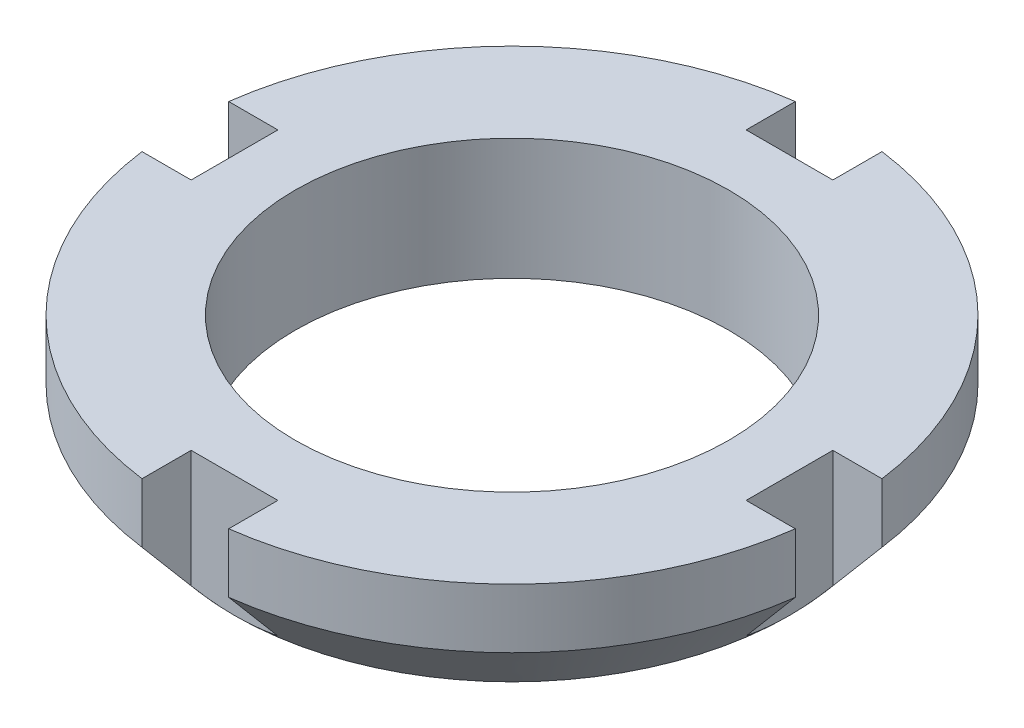
ISO-10303-21;
HEADER;
FILE_DESCRIPTION(('STEP AP214'),'2;1');
FILE_NAME('part.step','',(''),(''),'','','');
FILE_SCHEMA(('AUTOMOTIVE_DESIGN { 1 0 10303 214 1 1 1 1 }'));
ENDSEC;
DATA;
#1=APPLICATION_CONTEXT('core data for automotive mechanical design processes');
#2=APPLICATION_PROTOCOL_DEFINITION('international standard','automotive_design',2000,#1);
#3=PRODUCT_CONTEXT('',#1,'mechanical');
#4=PRODUCT('Part','Part','',(#3));
#5=PRODUCT_RELATED_PRODUCT_CATEGORY('part','',(#4));
#6=PRODUCT_DEFINITION_FORMATION('','',#4);
#7=PRODUCT_DEFINITION_CONTEXT('part definition',#1,'design');
#8=PRODUCT_DEFINITION('design','',#6,#7);
#9=PRODUCT_DEFINITION_SHAPE('','',#8);
#10=(LENGTH_UNIT() NAMED_UNIT(*) SI_UNIT(.MILLI.,.METRE.));
#11=(NAMED_UNIT(*) PLANE_ANGLE_UNIT() SI_UNIT($,.RADIAN.));
#12=(NAMED_UNIT(*) SI_UNIT($,.STERADIAN.) SOLID_ANGLE_UNIT());
#13=UNCERTAINTY_MEASURE_WITH_UNIT(LENGTH_MEASURE(1.E-05),#10,'distance_accuracy_value','');
#14=(GEOMETRIC_REPRESENTATION_CONTEXT(3) GLOBAL_UNCERTAINTY_ASSIGNED_CONTEXT((#13)) GLOBAL_UNIT_ASSIGNED_CONTEXT((#10,
#11,#12)) REPRESENTATION_CONTEXT('',''));
#15=CARTESIAN_POINT('',(0.,0.,0.));
#16=DIRECTION('',(0.,0.,1.));
#17=DIRECTION('',(1.,0.,0.));
#18=AXIS2_PLACEMENT_3D('',#15,#16,#17);
#19=CARTESIAN_POINT('',(0.,25.4,0.));
#20=DIRECTION('',(0.,1.,0.));
#21=DIRECTION('',(0.,0.,1.));
#22=AXIS2_PLACEMENT_3D('',#19,#20,#21);
#23=CYLINDRICAL_SURFACE('',#22,19.);
#24=CARTESIAN_POINT('',(0.,3.57526077778265,0.));
#25=DIRECTION('',(0.,1.,0.));
#26=DIRECTION('',(0.,0.,1.));
#27=AXIS2_PLACEMENT_3D('',#24,#25,#26);
#28=CIRCLE('',#27,19.);
#29=CARTESIAN_POINT('',(2.50000000000013,3.57526077778265,18.8348082018374));
#30=VERTEX_POINT('',#29);
#31=CARTESIAN_POINT('',(18.8348082018374,3.57526077778265,2.4999999999998));
#32=VERTEX_POINT('',#31);
#33=EDGE_CURVE('E182',#30,#32,#28,.T.);
#34=ORIENTED_EDGE('',*,*,#33,.T.);
#35=DIRECTION('',(0.,1.,0.));
#36=VECTOR('',#35,1.);
#37=CARTESIAN_POINT('',(18.8348082018374,0.,2.4999999999998));
#38=LINE('',#37,#36);
#39=CARTESIAN_POINT('',(18.8348082018374,7.,2.4999999999998));
#40=VERTEX_POINT('',#39);
#41=EDGE_CURVE('E167',#32,#40,#38,.T.);
#42=ORIENTED_EDGE('',*,*,#41,.T.);
#43=CARTESIAN_POINT('',(0.,7.,0.));
#44=DIRECTION('',(0.,1.,0.));
#45=DIRECTION('',(0.,0.,1.));
#46=AXIS2_PLACEMENT_3D('',#43,#44,#45);
#47=CIRCLE('',#46,19.);
#48=CARTESIAN_POINT('',(2.50000000000013,7.,18.8348082018374));
#49=VERTEX_POINT('',#48);
#50=EDGE_CURVE('E180',#49,#40,#47,.T.);
#51=ORIENTED_EDGE('',*,*,#50,.F.);
#52=DIRECTION('',(0.,1.,0.));
#53=VECTOR('',#52,1.);
#54=CARTESIAN_POINT('',(2.50000000000013,0.,18.8348082018374));
#55=LINE('',#54,#53);
#56=EDGE_CURVE('E435',#30,#49,#55,.T.);
#57=ORIENTED_EDGE('',*,*,#56,.F.);
#58=EDGE_LOOP('',(#34,#42,#51,#57));
#59=FACE_BOUND('',#58,.T.);
#60=ADVANCED_FACE('F34',(#59),#23,.T.);
#61=CARTESIAN_POINT('',(0.,0.,0.));
#62=DIRECTION('',(0.,1.,0.));
#63=DIRECTION('',(0.,0.,1.));
#64=AXIS2_PLACEMENT_3D('',#61,#62,#63);
#65=CONICAL_SURFACE('',#64,16.,0.698131700797729);
#66=CARTESIAN_POINT('',(15.9999999999999,1.61489603645068,-6.72295034859673));
#67=CARTESIAN_POINT('',(15.9999999999999,1.44047373509679,-6.34510869434057));
#68=CARTESIAN_POINT('',(15.9999999999999,1.27622662881702,-5.96228834394678));
#69=CARTESIAN_POINT('',(15.9999999999999,0.971984978819107,-5.18639270734956));
#70=CARTESIAN_POINT('',(15.9999999999999,0.832033632966314,-4.79330055663925));
#71=CARTESIAN_POINT('',(16.,0.581832993364578,-4.00075954074242));
#72=CARTESIAN_POINT('',(16.,0.471377135707684,-3.60137680626384));
#73=CARTESIAN_POINT('',(16.,0.283057566634732,-2.79516003789773));
#74=CARTESIAN_POINT('',(16.,0.205175049235498,-2.38833044541577));
#75=CARTESIAN_POINT('',(16.,0.084852403778267,-1.56570536854987));
#76=CARTESIAN_POINT('',(16.,0.042732059256799,-1.14986239904967));
#77=CARTESIAN_POINT('',(16.,-0.00274192414034929,-0.315979088964332));
#78=CARTESIAN_POINT('',(16.,-0.00609052371717588,0.102061530192854));
#79=CARTESIAN_POINT('',(16.,0.0262229924393839,0.937865584509501));
#80=CARTESIAN_POINT('',(16.,0.0620015940723355,1.35562446679382));
#81=CARTESIAN_POINT('',(16.,0.170871403131917,2.18612875911361));
#82=CARTESIAN_POINT('',(16.,0.243959665039616,2.59887456228794));
#83=CARTESIAN_POINT('',(16.,0.448304491130726,3.52691600287173));
#84=CARTESIAN_POINT('',(16.,0.589920916839801,4.03992242186738));
#85=CARTESIAN_POINT('',(16.0000000000001,0.919289860365098,5.05138775273406));
#86=CARTESIAN_POINT('',(16.0000000000001,1.10710332069625,5.54982646736915));
#87=CARTESIAN_POINT('',(16.0000000000001,1.41662702056414,6.28518883377966));
#88=CARTESIAN_POINT('',(16.0000000000001,1.52437168721538,6.52813607204458));
#89=CARTESIAN_POINT('',(16.0000000000001,1.74821220876534,7.01018655844719));
#90=CARTESIAN_POINT('',(16.0000000000001,1.86430868421804,7.24928951933009));
#91=CARTESIAN_POINT('',(16.0000000000001,2.10352112249927,7.72291220876518));
#92=CARTESIAN_POINT('',(16.0000000000001,2.22661169322447,7.9574448257165));
#93=CARTESIAN_POINT('',(16.0000000000001,2.47935755411826,8.42286567685714));
#94=CARTESIAN_POINT('',(16.0000000000001,2.60901101550432,8.65375490302752));
#95=CARTESIAN_POINT('',(16.0000000000001,2.74157327875824,8.88293783921777));
#96=B_SPLINE_CURVE_WITH_KNOTS('',3,(#66,#67,#68,#69,#70,#71,#72,#73,#74,#75,#76,#77,#78,#79,#80,
#81,#82,#83,#84,#85,#86,#87,#88,#89,#90,#91,#92,#93,#94,#95),.UNSPECIFIED.,.F.,.F.,(4,2,2,2,2,2,
2,2,2,2,2,2,2,2,4),(0.,1.24870523484581,2.49960842139877,3.74150672198465,4.98268702845874,
6.23485240214252,7.4871805222985,8.74324713315405,9.99921459553451,11.5931258240666,
13.1891511033666,13.9863275505997,14.7835632907354,15.5780696742465,16.3723558704137),.UNSPECIFIED.);
#97=CARTESIAN_POINT('',(16.,0.,-1.6759120133325E-13));
#98=VERTEX_POINT('',#97);
#99=CARTESIAN_POINT('',(16.,0.231360774678533,2.49999999999983));
#100=VERTEX_POINT('',#99);
#101=EDGE_CURVE('E48',#98,#100,#96,.T.);
#102=ORIENTED_EDGE('',*,*,#101,.T.);
#103=CARTESIAN_POINT('',(10.8234084053594,-5.82960231387655,2.49999999999988));
#104=CARTESIAN_POINT('',(11.2906948484899,-5.28692863711743,2.49999999999988));
#105=CARTESIAN_POINT('',(11.7571720455522,-4.74355986676855,2.49999999999987));
#106=CARTESIAN_POINT('',(12.6888761049545,-3.65575309559751,2.49999999999986));
#107=CARTESIAN_POINT('',(13.1541029698447,-3.1113150969601,2.49999999999986));
#108=CARTESIAN_POINT('',(14.0836742113699,-2.02169120495561,2.49999999999985));
#109=CARTESIAN_POINT('',(14.548018592201,-1.47650531516598,2.49999999999985));
#110=CARTESIAN_POINT('',(15.4760358948828,-0.385561874075875,2.49999999999984));
#111=CARTESIAN_POINT('',(15.9397088163375,0.160195677561378,2.49999999999983));
#112=CARTESIAN_POINT('',(17.329960321026,1.79811073321239,2.49999999999982));
#113=CARTESIAN_POINT('',(18.2557759858606,2.89091573333739,2.49999999999981));
#114=CARTESIAN_POINT('',(19.6435462290736,4.53093383921903,2.49999999999979));
#115=CARTESIAN_POINT('',(20.1059785550828,5.07774296956043,2.49999999999979));
#116=CARTESIAN_POINT('',(21.030577170086,6.17158581118825,2.49999999999978));
#117=CARTESIAN_POINT('',(21.4927434591653,6.71861952240252,2.49999999999977));
#118=CARTESIAN_POINT('',(21.954803110937,7.26574332983384,2.49999999999977));
#119=B_SPLINE_CURVE_WITH_KNOTS('',3,(#103,#104,#105,#106,#107,#108,#109,#110,#111,#112,#113,
#114,#115,#116,#117,#118),.UNSPECIFIED.,.F.,.F.,(4,2,2,2,2,2,2,4),(0.,2.14840652143852,
4.29680865762456,6.44520055278312,8.59359371433903,12.89035995552,15.0387534992744,
17.1871463534934),.UNSPECIFIED.);
#120=EDGE_CURVE('E11',#100,#32,#119,.T.);
#121=ORIENTED_EDGE('',*,*,#120,.T.);
#122=ORIENTED_EDGE('',*,*,#33,.F.);
#123=CARTESIAN_POINT('',(2.50000000000016,7.26574332983384,21.9548031109369));
#124=CARTESIAN_POINT('',(2.50000000000015,6.71861952240252,21.4927434591653));
#125=CARTESIAN_POINT('',(2.50000000000015,6.17158581118825,21.0305771700859));
#126=CARTESIAN_POINT('',(2.50000000000014,5.07774296956043,20.1059785550827));
#127=CARTESIAN_POINT('',(2.50000000000014,4.53093383921903,19.6435462290736));
#128=CARTESIAN_POINT('',(2.50000000000013,2.89091573333739,18.2557759858606));
#129=CARTESIAN_POINT('',(2.50000000000012,1.79811073321239,17.329960321026));
#130=CARTESIAN_POINT('',(2.50000000000011,0.160195677561379,15.9397088163375));
#131=CARTESIAN_POINT('',(2.50000000000011,-0.385561874075876,15.4760358948827));
#132=CARTESIAN_POINT('',(2.5000000000001,-1.47650531516598,14.5480185922009));
#133=CARTESIAN_POINT('',(2.5000000000001,-2.02169120495561,14.0836742113698));
#134=CARTESIAN_POINT('',(2.50000000000009,-3.1113150969601,13.1541029698446));
#135=CARTESIAN_POINT('',(2.50000000000009,-3.65575309559751,12.6888761049545));
#136=CARTESIAN_POINT('',(2.50000000000008,-4.74355986676855,11.7571720455522));
#137=CARTESIAN_POINT('',(2.50000000000008,-5.28692863711744,11.2906948484898));
#138=CARTESIAN_POINT('',(2.50000000000008,-5.82960231387655,10.8234084053594));
#139=B_SPLINE_CURVE_WITH_KNOTS('',3,(#123,#124,#125,#126,#127,#128,#129,#130,#131,#132,#133,
#134,#135,#136,#137,#138),.UNSPECIFIED.,.F.,.F.,(4,2,2,2,2,2,2,4),(0.,2.14839285421895,
4.29678639797339,8.59355263915434,10.7419458007103,12.8903376958688,15.0387398320549,
17.1871463534934),.UNSPECIFIED.);
#140=CARTESIAN_POINT('',(2.50000000000011,0.231360774678531,16.));
#141=VERTEX_POINT('',#140);
#142=EDGE_CURVE('E278',#30,#141,#139,.T.);
#143=ORIENTED_EDGE('',*,*,#142,.T.);
#144=CARTESIAN_POINT('',(-6.72295034859645,1.61489603645068,16.));
#145=CARTESIAN_POINT('',(-6.34510869434028,1.44047373509679,16.));
#146=CARTESIAN_POINT('',(-5.9622883439465,1.27622662881702,16.));
#147=CARTESIAN_POINT('',(-5.18639270734928,0.97198497881911,16.));
#148=CARTESIAN_POINT('',(-4.79330055663897,0.832033632966318,16.));
#149=CARTESIAN_POINT('',(-4.00075954074214,0.581832993364579,16.));
#150=CARTESIAN_POINT('',(-3.60137680626355,0.471377135707682,16.));
#151=CARTESIAN_POINT('',(-2.79516003789745,0.283057566634732,16.));
#152=CARTESIAN_POINT('',(-2.38833044541548,0.205175049235502,16.));
#153=CARTESIAN_POINT('',(-1.56570536854959,0.0848524037782735,16.));
#154=CARTESIAN_POINT('',(-1.14986239904938,0.0427320592568017,16.));
#155=CARTESIAN_POINT('',(-0.315979088964047,-0.00274192414035051,16.));
#156=CARTESIAN_POINT('',(0.102061530193139,-0.00609052371717725,16.));
#157=CARTESIAN_POINT('',(0.937865584509786,0.0262229924393843,16.));
#158=CARTESIAN_POINT('',(1.35562446679411,0.0620015940723377,16.));
#159=CARTESIAN_POINT('',(2.1861287591139,0.17087140313192,16.));
#160=CARTESIAN_POINT('',(2.59887456228823,0.243959665039617,16.));
#161=CARTESIAN_POINT('',(3.52691600287202,0.448304491130729,16.));
#162=CARTESIAN_POINT('',(4.03992242186767,0.589920916839806,16.));
#163=CARTESIAN_POINT('',(5.05138775273435,0.919289860365105,16.));
#164=CARTESIAN_POINT('',(5.54982646736944,1.10710332069626,16.));
#165=CARTESIAN_POINT('',(6.28518883377995,1.41662702056414,16.));
#166=CARTESIAN_POINT('',(6.52813607204487,1.52437168721538,16.));
#167=CARTESIAN_POINT('',(7.01018655844748,1.74821220876534,15.9999999999999));
#168=CARTESIAN_POINT('',(7.24928951933037,1.86430868421805,15.9999999999999));
#169=CARTESIAN_POINT('',(7.72291220876547,2.10352112249928,15.9999999999999));
#170=CARTESIAN_POINT('',(7.95744482571679,2.22661169322448,15.9999999999999));
#171=CARTESIAN_POINT('',(8.42286567685743,2.47935755411826,15.9999999999999));
#172=CARTESIAN_POINT('',(8.65375490302781,2.60901101550433,15.9999999999999));
#173=CARTESIAN_POINT('',(8.88293783921806,2.74157327875826,15.9999999999999));
#174=B_SPLINE_CURVE_WITH_KNOTS('',3,(#144,#145,#146,#147,#148,#149,#150,#151,#152,#153,#154,
#155,#156,#157,#158,#159,#160,#161,#162,#163,#164,#165,#166,#167,#168,#169,#170,#171,#172,#173),
.UNSPECIFIED.,.F.,.F.,(4,2,2,2,2,2,2,2,2,2,2,2,2,2,4),(0.,1.24870523484581,2.49960842139877,
3.74150672198464,4.98268702845874,6.23485240214253,7.4871805222985,8.74324713315405,
9.99921459553451,11.5931258240666,13.1891511033666,13.9863275505997,14.7835632907354,
15.5780696742465,16.3723558704137),.UNSPECIFIED.);
#175=CARTESIAN_POINT('',(1.117274675555E-13,0.,16.));
#176=VERTEX_POINT('',#175);
#177=EDGE_CURVE('E287',#141,#176,#174,.F.);
#178=ORIENTED_EDGE('',*,*,#177,.T.);
#179=CARTESIAN_POINT('',(0.,0.,0.));
#180=DIRECTION('',(0.,1.,0.));
#181=DIRECTION('',(0.,0.,1.));
#182=AXIS2_PLACEMENT_3D('',#179,#180,#181);
#183=CIRCLE('',#182,16.);
#184=EDGE_CURVE('E388',#176,#98,#183,.T.);
#185=ORIENTED_EDGE('',*,*,#184,.T.);
#186=EDGE_LOOP('',(#102,#121,#122,#143,#178,#185));
#187=FACE_BOUND('',#186,.T.);
#188=ADVANCED_FACE('F335',(#187),#65,.T.);
#189=CARTESIAN_POINT('',(-18.8348082018374,3.57526077778265,2.50000000000007));
#190=VERTEX_POINT('',#189);
#191=CARTESIAN_POINT('',(-2.49999999999987,3.57526077778265,18.8348082018374));
#192=VERTEX_POINT('',#191);
#193=EDGE_CURVE('E373',#190,#192,#28,.T.);
#194=ORIENTED_EDGE('',*,*,#193,.T.);
#195=DIRECTION('',(0.,1.,0.));
#196=VECTOR('',#195,1.);
#197=CARTESIAN_POINT('',(-2.49999999999987,0.,18.8348082018374));
#198=LINE('',#197,#196);
#199=CARTESIAN_POINT('',(-2.49999999999987,7.,18.8348082018374));
#200=VERTEX_POINT('',#199);
#201=EDGE_CURVE('E432',#192,#200,#198,.T.);
#202=ORIENTED_EDGE('',*,*,#201,.T.);
#203=CARTESIAN_POINT('',(-18.8348082018374,7.,2.50000000000007));
#204=VERTEX_POINT('',#203);
#205=EDGE_CURVE('E190',#204,#200,#47,.T.);
#206=ORIENTED_EDGE('',*,*,#205,.F.);
#207=DIRECTION('',(0.,1.,0.));
#208=VECTOR('',#207,1.);
#209=CARTESIAN_POINT('',(-18.8348082018374,0.,2.50000000000007));
#210=LINE('',#209,#208);
#211=EDGE_CURVE('E418',#190,#204,#210,.T.);
#212=ORIENTED_EDGE('',*,*,#211,.F.);
#213=EDGE_LOOP('',(#194,#202,#206,#212));
#214=FACE_BOUND('',#213,.T.);
#215=ADVANCED_FACE('F336',(#214),#23,.T.);
#216=CARTESIAN_POINT('',(-2.49999999999989,0.231360774678531,16.));
#217=VERTEX_POINT('',#216);
#218=EDGE_CURVE('E310',#176,#217,#174,.F.);
#219=ORIENTED_EDGE('',*,*,#218,.T.);
#220=CARTESIAN_POINT('',(-2.49999999999992,-5.82960231387655,10.8234084053594));
#221=CARTESIAN_POINT('',(-2.49999999999992,-5.28692863711744,11.2906948484899));
#222=CARTESIAN_POINT('',(-2.49999999999992,-4.74355986676855,11.7571720455522));
#223=CARTESIAN_POINT('',(-2.49999999999991,-3.65575309559751,12.6888761049545));
#224=CARTESIAN_POINT('',(-2.49999999999991,-3.1113150969601,13.1541029698447));
#225=CARTESIAN_POINT('',(-2.4999999999999,-2.02169120495562,14.0836742113699));
#226=CARTESIAN_POINT('',(-2.4999999999999,-1.47650531516598,14.548018592201));
#227=CARTESIAN_POINT('',(-2.49999999999989,-0.38556187407588,15.4760358948828));
#228=CARTESIAN_POINT('',(-2.49999999999989,0.160195677561375,15.9397088163375));
#229=CARTESIAN_POINT('',(-2.49999999999988,1.79811073321239,17.329960321026));
#230=CARTESIAN_POINT('',(-2.49999999999987,2.89091573333739,18.2557759858606));
#231=CARTESIAN_POINT('',(-2.49999999999986,4.53093383921902,19.6435462290736));
#232=CARTESIAN_POINT('',(-2.49999999999986,5.07774296956043,20.1059785550828));
#233=CARTESIAN_POINT('',(-2.49999999999985,6.17158581118825,21.030577170086));
#234=CARTESIAN_POINT('',(-2.49999999999985,6.71861952240252,21.4927434591653));
#235=CARTESIAN_POINT('',(-2.49999999999984,7.26574332983384,21.954803110937));
#236=B_SPLINE_CURVE_WITH_KNOTS('',3,(#220,#221,#222,#223,#224,#225,#226,#227,#228,#229,#230,
#231,#232,#233,#234,#235),.UNSPECIFIED.,.F.,.F.,(4,2,2,2,2,2,2,4),(0.,2.14840652143852,
4.29680865762456,6.44520055278312,8.59359371433903,12.89035995552,15.0387534992744,
17.1871463534934),.UNSPECIFIED.);
#237=EDGE_CURVE('E302',#217,#192,#236,.T.);
#238=ORIENTED_EDGE('',*,*,#237,.T.);
#239=ORIENTED_EDGE('',*,*,#193,.F.);
#240=CARTESIAN_POINT('',(-21.9548031109369,7.26574332983384,2.50000000000008));
#241=CARTESIAN_POINT('',(-21.4927434591653,6.71861952240253,2.50000000000008));
#242=CARTESIAN_POINT('',(-21.0305771700859,6.17158581118825,2.50000000000008));
#243=CARTESIAN_POINT('',(-20.1059785550827,5.07774296956043,2.50000000000007));
#244=CARTESIAN_POINT('',(-19.6435462290736,4.53093383921903,2.50000000000007));
#245=CARTESIAN_POINT('',(-18.2557759858606,2.89091573333739,2.50000000000007));
#246=CARTESIAN_POINT('',(-17.329960321026,1.79811073321239,2.50000000000006));
#247=CARTESIAN_POINT('',(-15.9397088163375,0.160195677561376,2.50000000000006));
#248=CARTESIAN_POINT('',(-15.4760358948827,-0.385561874075879,2.50000000000006));
#249=CARTESIAN_POINT('',(-14.5480185922009,-1.47650531516598,2.50000000000005));
#250=CARTESIAN_POINT('',(-14.0836742113698,-2.02169120495562,2.50000000000005));
#251=CARTESIAN_POINT('',(-13.1541029698446,-3.1113150969601,2.50000000000005));
#252=CARTESIAN_POINT('',(-12.6888761049545,-3.65575309559751,2.50000000000005));
#253=CARTESIAN_POINT('',(-11.7571720455522,-4.74355986676855,2.50000000000004));
#254=CARTESIAN_POINT('',(-11.2906948484898,-5.28692863711744,2.50000000000004));
#255=CARTESIAN_POINT('',(-10.8234084053594,-5.82960231387655,2.50000000000004));
#256=B_SPLINE_CURVE_WITH_KNOTS('',3,(#240,#241,#242,#243,#244,#245,#246,#247,#248,#249,#250,
#251,#252,#253,#254,#255),.UNSPECIFIED.,.F.,.F.,(4,2,2,2,2,2,2,4),(0.,2.14839285421895,
4.29678639797339,8.59355263915435,10.7419458007103,12.8903376958688,15.0387398320549,
17.1871463534934),.UNSPECIFIED.);
#257=CARTESIAN_POINT('',(-16.,0.231360774678528,2.50000000000006));
#258=VERTEX_POINT('',#257);
#259=EDGE_CURVE('E244',#190,#258,#256,.T.);
#260=ORIENTED_EDGE('',*,*,#259,.T.);
#261=CARTESIAN_POINT('',(-16.,1.61489603645068,-6.7229503485965));
#262=CARTESIAN_POINT('',(-16.,1.44047373509679,-6.34510869434034));
#263=CARTESIAN_POINT('',(-16.,1.27622662881702,-5.96228834394656));
#264=CARTESIAN_POINT('',(-16.,0.971984978819105,-5.18639270734934));
#265=CARTESIAN_POINT('',(-16.,0.832033632966313,-4.79330055663902));
#266=CARTESIAN_POINT('',(-16.,0.581832993364577,-4.00075954074219));
#267=CARTESIAN_POINT('',(-16.,0.471377135707682,-3.60137680626361));
#268=CARTESIAN_POINT('',(-16.,0.283057566634733,-2.7951600378975));
#269=CARTESIAN_POINT('',(-16.,0.205175049235501,-2.38833044541554));
#270=CARTESIAN_POINT('',(-16.,0.0848524037782706,-1.56570536854964));
#271=CARTESIAN_POINT('',(-16.,0.0427320592567998,-1.14986239904944));
#272=CARTESIAN_POINT('',(-16.,-0.00274192414035069,-0.315979088964102));
#273=CARTESIAN_POINT('',(-16.,-0.00609052371717659,0.102061530193084));
#274=CARTESIAN_POINT('',(-16.,0.0262229924393837,0.93786558450973));
#275=CARTESIAN_POINT('',(-16.,0.062001594072335,1.35562446679405));
#276=CARTESIAN_POINT('',(-16.,0.170871403131917,2.18612875911384));
#277=CARTESIAN_POINT('',(-16.,0.243959665039615,2.59887456228817));
#278=CARTESIAN_POINT('',(-16.,0.448304491130727,3.52691600287196));
#279=CARTESIAN_POINT('',(-16.,0.589920916839803,4.03992242186761));
#280=CARTESIAN_POINT('',(-16.,0.919289860365102,5.05138775273429));
#281=CARTESIAN_POINT('',(-16.,1.10710332069625,5.54982646736938));
#282=CARTESIAN_POINT('',(-16.,1.41662702056414,6.28518883377989));
#283=CARTESIAN_POINT('',(-16.,1.52437168721538,6.52813607204481));
#284=CARTESIAN_POINT('',(-16.,1.74821220876534,7.01018655844742));
#285=CARTESIAN_POINT('',(-16.,1.86430868421805,7.24928951933032));
#286=CARTESIAN_POINT('',(-16.,2.10352112249928,7.72291220876542));
#287=CARTESIAN_POINT('',(-16.,2.22661169322448,7.95744482571674));
#288=CARTESIAN_POINT('',(-16.,2.47935755411826,8.42286567685738));
#289=CARTESIAN_POINT('',(-16.,2.60901101550433,8.65375490302775));
#290=CARTESIAN_POINT('',(-16.,2.74157327875825,8.88293783921801));
#291=B_SPLINE_CURVE_WITH_KNOTS('',3,(#261,#262,#263,#264,#265,#266,#267,#268,#269,#270,#271,
#272,#273,#274,#275,#276,#277,#278,#279,#280,#281,#282,#283,#284,#285,#286,#287,#288,#289,#290),
.UNSPECIFIED.,.F.,.F.,(4,2,2,2,2,2,2,2,2,2,2,2,2,2,4),(0.,1.24870523484581,2.49960842139877,
3.74150672198464,4.98268702845874,6.23485240214253,7.4871805222985,8.74324713315405,
9.99921459553451,11.5931258240666,13.1891511033666,13.9863275505997,14.7835632907354,
15.5780696742465,16.3723558704137),.UNSPECIFIED.);
#292=CARTESIAN_POINT('',(-16.,0.,0.));
#293=VERTEX_POINT('',#292);
#294=EDGE_CURVE('E253',#258,#293,#291,.F.);
#295=ORIENTED_EDGE('',*,*,#294,.T.);
#296=EDGE_CURVE('E382',#293,#176,#183,.T.);
#297=ORIENTED_EDGE('',*,*,#296,.T.);
#298=EDGE_LOOP('',(#219,#238,#239,#260,#295,#297));
#299=FACE_BOUND('',#298,.T.);
#300=ADVANCED_FACE('F342',(#299),#65,.T.);
#301=CARTESIAN_POINT('',(-2.5,3.57526077778265,-18.8348082018374));
#302=VERTEX_POINT('',#301);
#303=CARTESIAN_POINT('',(-18.8348082018374,3.57526077778265,-2.49999999999994));
#304=VERTEX_POINT('',#303);
#305=EDGE_CURVE('E195',#302,#304,#28,.T.);
#306=ORIENTED_EDGE('',*,*,#305,.T.);
#307=DIRECTION('',(0.,1.,0.));
#308=VECTOR('',#307,1.);
#309=CARTESIAN_POINT('',(-18.8348082018374,0.,-2.49999999999994));
#310=LINE('',#309,#308);
#311=CARTESIAN_POINT('',(-18.8348082018374,7.,-2.49999999999994));
#312=VERTEX_POINT('',#311);
#313=EDGE_CURVE('E371',#304,#312,#310,.T.);
#314=ORIENTED_EDGE('',*,*,#313,.T.);
#315=CARTESIAN_POINT('',(-2.5,7.,-18.8348082018374));
#316=VERTEX_POINT('',#315);
#317=EDGE_CURVE('E194',#316,#312,#47,.T.);
#318=ORIENTED_EDGE('',*,*,#317,.F.);
#319=DIRECTION('',(0.,1.,0.));
#320=VECTOR('',#319,1.);
#321=CARTESIAN_POINT('',(-2.5,0.,-18.8348082018374));
#322=LINE('',#321,#320);
#323=EDGE_CURVE('E372',#302,#316,#322,.T.);
#324=ORIENTED_EDGE('',*,*,#323,.F.);
#325=EDGE_LOOP('',(#306,#314,#318,#324));
#326=FACE_BOUND('',#325,.T.);
#327=ADVANCED_FACE('F346',(#326),#23,.T.);
#328=CARTESIAN_POINT('',(-16.,0.231360774678533,-2.49999999999994));
#329=VERTEX_POINT('',#328);
#330=EDGE_CURVE('E279',#293,#329,#291,.F.);
#331=ORIENTED_EDGE('',*,*,#330,.T.);
#332=CARTESIAN_POINT('',(-10.8234084053594,-5.82960231387655,-2.49999999999996));
#333=CARTESIAN_POINT('',(-11.2906948484899,-5.28692863711744,-2.49999999999996));
#334=CARTESIAN_POINT('',(-11.7571720455522,-4.74355986676855,-2.49999999999996));
#335=CARTESIAN_POINT('',(-12.6888761049545,-3.65575309559751,-2.49999999999995));
#336=CARTESIAN_POINT('',(-13.1541029698447,-3.1113150969601,-2.49999999999995));
#337=CARTESIAN_POINT('',(-14.0836742113699,-2.02169120495561,-2.49999999999995));
#338=CARTESIAN_POINT('',(-14.548018592201,-1.47650531516598,-2.49999999999995));
#339=CARTESIAN_POINT('',(-15.4760358948828,-0.385561874075879,-2.49999999999994));
#340=CARTESIAN_POINT('',(-15.9397088163375,0.160195677561375,-2.49999999999994));
#341=CARTESIAN_POINT('',(-17.329960321026,1.79811073321239,-2.49999999999994));
#342=CARTESIAN_POINT('',(-18.2557759858606,2.89091573333739,-2.49999999999993));
#343=CARTESIAN_POINT('',(-19.6435462290736,4.53093383921903,-2.49999999999993));
#344=CARTESIAN_POINT('',(-20.1059785550828,5.07774296956043,-2.49999999999993));
#345=CARTESIAN_POINT('',(-21.030577170086,6.17158581118825,-2.49999999999992));
#346=CARTESIAN_POINT('',(-21.4927434591653,6.71861952240252,-2.49999999999992));
#347=CARTESIAN_POINT('',(-21.954803110937,7.26574332983384,-2.49999999999992));
#348=B_SPLINE_CURVE_WITH_KNOTS('',3,(#332,#333,#334,#335,#336,#337,#338,#339,#340,#341,#342,
#343,#344,#345,#346,#347),.UNSPECIFIED.,.F.,.F.,(4,2,2,2,2,2,2,4),(0.,2.14840652143852,
4.29680865762456,6.44520055278312,8.59359371433903,12.89035995552,15.0387534992744,
17.1871463534934),.UNSPECIFIED.);
#349=EDGE_CURVE('E271',#329,#304,#348,.T.);
#350=ORIENTED_EDGE('',*,*,#349,.T.);
#351=ORIENTED_EDGE('',*,*,#305,.F.);
#352=CARTESIAN_POINT('',(-2.5,7.26574332983385,-21.954803110937));
#353=CARTESIAN_POINT('',(-2.5,6.71861952240253,-21.4927434591653));
#354=CARTESIAN_POINT('',(-2.5,6.17158581118825,-21.030577170086));
#355=CARTESIAN_POINT('',(-2.5,5.07774296956044,-20.1059785550828));
#356=CARTESIAN_POINT('',(-2.5,4.53093383921903,-19.6435462290736));
#357=CARTESIAN_POINT('',(-2.5,2.89091573333739,-18.2557759858606));
#358=CARTESIAN_POINT('',(-2.5,1.7981107332124,-17.329960321026));
#359=CARTESIAN_POINT('',(-2.5,0.160195677561379,-15.9397088163375));
#360=CARTESIAN_POINT('',(-2.5,-0.385561874075875,-15.4760358948827));
#361=CARTESIAN_POINT('',(-2.5,-1.47650531516598,-14.548018592201));
#362=CARTESIAN_POINT('',(-2.5,-2.02169120495561,-14.0836742113698));
#363=CARTESIAN_POINT('',(-2.5,-3.1113150969601,-13.1541029698447));
#364=CARTESIAN_POINT('',(-2.5,-3.65575309559751,-12.6888761049545));
#365=CARTESIAN_POINT('',(-2.5,-4.74355986676855,-11.7571720455522));
#366=CARTESIAN_POINT('',(-2.5,-5.28692863711744,-11.2906948484898));
#367=CARTESIAN_POINT('',(-2.5,-5.82960231387655,-10.8234084053594));
#368=B_SPLINE_CURVE_WITH_KNOTS('',3,(#352,#353,#354,#355,#356,#357,#358,#359,#360,#361,#362,
#363,#364,#365,#366,#367),.UNSPECIFIED.,.F.,.F.,(4,2,2,2,2,2,2,4),(0.,2.14839285421895,
4.2967863979734,8.59355263915435,10.7419458007103,12.8903376958688,15.0387398320549,
17.1871463534934),.UNSPECIFIED.);
#369=CARTESIAN_POINT('',(-2.5,0.231360774678531,-16.));
#370=VERTEX_POINT('',#369);
#371=EDGE_CURVE('E206',#302,#370,#368,.T.);
#372=ORIENTED_EDGE('',*,*,#371,.T.);
#373=CARTESIAN_POINT('',(-6.72295034859656,1.61489603645068,-16.));
#374=CARTESIAN_POINT('',(-6.3451086943404,1.44047373509679,-16.));
#375=CARTESIAN_POINT('',(-5.96228834394662,1.27622662881703,-16.));
#376=CARTESIAN_POINT('',(-5.1863927073494,0.971984978819107,-16.));
#377=CARTESIAN_POINT('',(-4.79330055663909,0.832033632966313,-16.));
#378=CARTESIAN_POINT('',(-4.00075954074226,0.581832993364577,-16.));
#379=CARTESIAN_POINT('',(-3.60137680626367,0.471377135707684,-16.));
#380=CARTESIAN_POINT('',(-2.79516003789756,0.283057566634734,-16.));
#381=CARTESIAN_POINT('',(-2.3883304454156,0.2051750492355,-16.));
#382=CARTESIAN_POINT('',(-1.5657053685497,0.0848524037782682,-16.));
#383=CARTESIAN_POINT('',(-1.1498623990495,0.0427320592567982,-16.));
#384=CARTESIAN_POINT('',(-0.315979088964163,-0.00274192414035124,-16.));
#385=CARTESIAN_POINT('',(0.102061530193023,-0.00609052371717709,-16.));
#386=CARTESIAN_POINT('',(0.93786558450967,0.0262229924393842,-16.));
#387=CARTESIAN_POINT('',(1.35562446679399,0.0620015940723365,-16.));
#388=CARTESIAN_POINT('',(2.18612875911378,0.170871403131917,-16.));
#389=CARTESIAN_POINT('',(2.59887456228811,0.243959665039614,-16.));
#390=CARTESIAN_POINT('',(3.5269160028719,0.448304491130723,-16.));
#391=CARTESIAN_POINT('',(4.03992242186755,0.589920916839799,-16.));
#392=CARTESIAN_POINT('',(5.05138775273422,0.919289860365098,-16.));
#393=CARTESIAN_POINT('',(5.54982646736932,1.10710332069625,-16.));
#394=CARTESIAN_POINT('',(6.28518883377982,1.41662702056414,-16.));
#395=CARTESIAN_POINT('',(6.52813607204474,1.52437168721538,-16.));
#396=CARTESIAN_POINT('',(7.01018655844736,1.74821220876534,-16.));
#397=CARTESIAN_POINT('',(7.24928951933025,1.86430868421804,-16.));
#398=CARTESIAN_POINT('',(7.72291220876535,2.10352112249927,-16.));
#399=CARTESIAN_POINT('',(7.95744482571667,2.22661169322447,-16.));
#400=CARTESIAN_POINT('',(8.42286567685731,2.47935755411825,-16.));
#401=CARTESIAN_POINT('',(8.65375490302769,2.60901101550432,-16.));
#402=CARTESIAN_POINT('',(8.88293783921794,2.74157327875824,-16.));
#403=B_SPLINE_CURVE_WITH_KNOTS('',3,(#373,#374,#375,#376,#377,#378,#379,#380,#381,#382,#383,
#384,#385,#386,#387,#388,#389,#390,#391,#392,#393,#394,#395,#396,#397,#398,#399,#400,#401,#402),
.UNSPECIFIED.,.F.,.F.,(4,2,2,2,2,2,2,2,2,2,2,2,2,2,4),(0.,1.24870523484581,2.49960842139876,
3.74150672198464,4.98268702845874,6.23485240214253,7.4871805222985,8.74324713315405,
9.99921459553451,11.5931258240666,13.1891511033666,13.9863275505997,14.7835632907354,
15.5780696742465,16.3723558704137),.UNSPECIFIED.);
#404=CARTESIAN_POINT('',(0.,0.,-16.));
#405=VERTEX_POINT('',#404);
#406=EDGE_CURVE('E214',#370,#405,#403,.T.);
#407=ORIENTED_EDGE('',*,*,#406,.T.);
#408=EDGE_CURVE('E376',#405,#293,#183,.T.);
#409=ORIENTED_EDGE('',*,*,#408,.T.);
#410=EDGE_LOOP('',(#331,#350,#351,#372,#407,#409));
#411=FACE_BOUND('',#410,.T.);
#412=ADVANCED_FACE('F354',(#411),#65,.T.);
#413=CARTESIAN_POINT('',(12.5,0.,0.));
#414=DIRECTION('',(0.,1.,0.));
#415=DIRECTION('',(0.,0.,1.));
#416=AXIS2_PLACEMENT_3D('',#413,#414,#415);
#417=PLANE('',#416);
#418=ORIENTED_EDGE('',*,*,#408,.F.);
#419=EDGE_CURVE('E383',#98,#405,#183,.T.);
#420=ORIENTED_EDGE('',*,*,#419,.F.);
#421=ORIENTED_EDGE('',*,*,#184,.F.);
#422=ORIENTED_EDGE('',*,*,#296,.F.);
#423=EDGE_LOOP('',(#418,#420,#421,#422));
#424=FACE_BOUND('',#423,.T.);
#425=CARTESIAN_POINT('',(0.,0.,0.));
#426=DIRECTION('',(0.,1.,0.));
#427=DIRECTION('',(0.,0.,1.));
#428=AXIS2_PLACEMENT_3D('',#425,#426,#427);
#429=CIRCLE('',#428,12.5);
#430=CARTESIAN_POINT('',(0.,0.,12.5));
#431=VERTEX_POINT('',#430);
#432=EDGE_CURVE('E203',#431,#431,#429,.T.);
#433=ORIENTED_EDGE('',*,*,#432,.T.);
#434=EDGE_LOOP('',(#433));
#435=FACE_BOUND('',#434,.T.);
#436=ADVANCED_FACE('F36',(#424,#435),#417,.F.);
#437=CARTESIAN_POINT('',(0.,25.4,0.));
#438=DIRECTION('',(0.,1.,0.));
#439=DIRECTION('',(0.,0.,1.));
#440=AXIS2_PLACEMENT_3D('',#437,#438,#439);
#441=CYLINDRICAL_SURFACE('',#440,12.5);
#442=ORIENTED_EDGE('',*,*,#432,.F.);
#443=EDGE_LOOP('',(#442));
#444=FACE_BOUND('',#443,.T.);
#445=CARTESIAN_POINT('',(0.,7.,0.));
#446=DIRECTION('',(0.,1.,0.));
#447=DIRECTION('',(0.,0.,1.));
#448=AXIS2_PLACEMENT_3D('',#445,#446,#447);
#449=CIRCLE('',#448,12.5);
#450=CARTESIAN_POINT('',(0.,7.,12.5));
#451=VERTEX_POINT('',#450);
#452=EDGE_CURVE('E199',#451,#451,#449,.T.);
#453=ORIENTED_EDGE('',*,*,#452,.T.);
#454=EDGE_LOOP('',(#453));
#455=FACE_BOUND('',#454,.T.);
#456=ADVANCED_FACE('F355',(#444,#455),#441,.F.);
#457=CARTESIAN_POINT('',(12.5,7.,0.));
#458=DIRECTION('',(0.,-1.,0.));
#459=DIRECTION('',(0.,0.,-1.));
#460=AXIS2_PLACEMENT_3D('',#457,#458,#459);
#461=PLANE('',#460);
#462=ORIENTED_EDGE('',*,*,#452,.F.);
#463=EDGE_LOOP('',(#462));
#464=FACE_BOUND('',#463,.T.);
#465=ORIENTED_EDGE('',*,*,#50,.T.);
#466=DIRECTION('',(1.,0.,0.));
#467=VECTOR('',#466,1.);
#468=CARTESIAN_POINT('',(16.,7.,2.49999999999983));
#469=LINE('',#468,#467);
#470=CARTESIAN_POINT('',(16.,7.,2.49999999999983));
#471=VERTEX_POINT('',#470);
#472=EDGE_CURVE('E164',#471,#40,#469,.T.);
#473=ORIENTED_EDGE('',*,*,#472,.F.);
#474=DIRECTION('',(0.,0.,1.));
#475=VECTOR('',#474,1.);
#476=CARTESIAN_POINT('',(16.,7.,-2.50000000000017));
#477=LINE('',#476,#475);
#478=CARTESIAN_POINT('',(16.,7.,-2.50000000000017));
#479=VERTEX_POINT('',#478);
#480=EDGE_CURVE('E184',#479,#471,#477,.T.);
#481=ORIENTED_EDGE('',*,*,#480,.F.);
#482=DIRECTION('',(-1.,0.,0.));
#483=VECTOR('',#482,1.);
#484=CARTESIAN_POINT('',(16.,7.,-2.50000000000017));
#485=LINE('',#484,#483);
#486=CARTESIAN_POINT('',(18.8348082018373,7.,-2.5000000000002));
#487=VERTEX_POINT('',#486);
#488=EDGE_CURVE('E174',#487,#479,#485,.T.);
#489=ORIENTED_EDGE('',*,*,#488,.F.);
#490=CARTESIAN_POINT('',(2.5,7.,-18.8348082018374));
#491=VERTEX_POINT('',#490);
#492=EDGE_CURVE('E191',#487,#491,#47,.T.);
#493=ORIENTED_EDGE('',*,*,#492,.T.);
#494=DIRECTION('',(0.,0.,-1.));
#495=VECTOR('',#494,1.);
#496=CARTESIAN_POINT('',(2.5,7.,-16.));
#497=LINE('',#496,#495);
#498=CARTESIAN_POINT('',(2.5,7.,-16.));
#499=VERTEX_POINT('',#498);
#500=EDGE_CURVE('E412',#499,#491,#497,.T.);
#501=ORIENTED_EDGE('',*,*,#500,.F.);
#502=DIRECTION('',(1.,0.,0.));
#503=VECTOR('',#502,1.);
#504=CARTESIAN_POINT('',(-2.5,7.,-16.));
#505=LINE('',#504,#503);
#506=CARTESIAN_POINT('',(-2.5,7.,-16.));
#507=VERTEX_POINT('',#506);
#508=EDGE_CURVE('E403',#507,#499,#505,.T.);
#509=ORIENTED_EDGE('',*,*,#508,.F.);
#510=DIRECTION('',(0.,0.,1.));
#511=VECTOR('',#510,1.);
#512=CARTESIAN_POINT('',(-2.5,7.,-16.));
#513=LINE('',#512,#511);
#514=EDGE_CURVE('E407',#316,#507,#513,.T.);
#515=ORIENTED_EDGE('',*,*,#514,.F.);
#516=ORIENTED_EDGE('',*,*,#317,.T.);
#517=DIRECTION('',(-1.,0.,0.));
#518=VECTOR('',#517,1.);
#519=CARTESIAN_POINT('',(-16.,7.,-2.49999999999994));
#520=LINE('',#519,#518);
#521=CARTESIAN_POINT('',(-16.,7.,-2.49999999999994));
#522=VERTEX_POINT('',#521);
#523=EDGE_CURVE('E429',#522,#312,#520,.T.);
#524=ORIENTED_EDGE('',*,*,#523,.F.);
#525=DIRECTION('',(0.,0.,-1.));
#526=VECTOR('',#525,1.);
#527=CARTESIAN_POINT('',(-16.,7.,2.50000000000006));
#528=LINE('',#527,#526);
#529=CARTESIAN_POINT('',(-16.,7.,2.50000000000006));
#530=VERTEX_POINT('',#529);
#531=EDGE_CURVE('E419',#530,#522,#528,.T.);
#532=ORIENTED_EDGE('',*,*,#531,.F.);
#533=DIRECTION('',(1.,0.,0.));
#534=VECTOR('',#533,1.);
#535=CARTESIAN_POINT('',(-16.,7.,2.50000000000006));
#536=LINE('',#535,#534);
#537=EDGE_CURVE('E426',#204,#530,#536,.T.);
#538=ORIENTED_EDGE('',*,*,#537,.F.);
#539=ORIENTED_EDGE('',*,*,#205,.T.);
#540=DIRECTION('',(0.,0.,1.));
#541=VECTOR('',#540,1.);
#542=CARTESIAN_POINT('',(-2.49999999999989,7.,16.));
#543=LINE('',#542,#541);
#544=CARTESIAN_POINT('',(-2.49999999999989,7.,16.));
#545=VERTEX_POINT('',#544);
#546=EDGE_CURVE('E443',#545,#200,#543,.T.);
#547=ORIENTED_EDGE('',*,*,#546,.F.);
#548=DIRECTION('',(-1.,0.,0.));
#549=VECTOR('',#548,1.);
#550=CARTESIAN_POINT('',(2.50000000000011,7.,16.));
#551=LINE('',#550,#549);
#552=CARTESIAN_POINT('',(2.50000000000011,7.,16.));
#553=VERTEX_POINT('',#552);
#554=EDGE_CURVE('E436',#553,#545,#551,.T.);
#555=ORIENTED_EDGE('',*,*,#554,.F.);
#556=DIRECTION('',(0.,0.,-1.));
#557=VECTOR('',#556,1.);
#558=CARTESIAN_POINT('',(2.50000000000011,7.,16.));
#559=LINE('',#558,#557);
#560=EDGE_CURVE('E189',#49,#553,#559,.T.);
#561=ORIENTED_EDGE('',*,*,#560,.F.);
#562=EDGE_LOOP('',(#465,#473,#481,#489,#493,#501,#509,#515,#516,#524,#532,#538,#539,#547,#555,#561));
#563=FACE_BOUND('',#562,.T.);
#564=ADVANCED_FACE('F187',(#464,#563),#461,.F.);
#565=ORIENTED_EDGE('',*,*,#492,.F.);
#566=DIRECTION('',(0.,1.,0.));
#567=VECTOR('',#566,1.);
#568=CARTESIAN_POINT('',(18.8348082018373,0.,-2.5000000000002));
#569=LINE('',#568,#567);
#570=CARTESIAN_POINT('',(18.8348082018373,3.57526077778265,-2.5000000000002));
#571=VERTEX_POINT('',#570);
#572=EDGE_CURVE('E183',#571,#487,#569,.T.);
#573=ORIENTED_EDGE('',*,*,#572,.F.);
#574=CARTESIAN_POINT('',(2.5,3.57526077778265,-18.8348082018374));
#575=VERTEX_POINT('',#574);
#576=EDGE_CURVE('E374',#571,#575,#28,.T.);
#577=ORIENTED_EDGE('',*,*,#576,.T.);
#578=DIRECTION('',(0.,1.,0.));
#579=VECTOR('',#578,1.);
#580=CARTESIAN_POINT('',(2.5,0.,-18.8348082018374));
#581=LINE('',#580,#579);
#582=EDGE_CURVE('E406',#575,#491,#581,.T.);
#583=ORIENTED_EDGE('',*,*,#582,.T.);
#584=EDGE_LOOP('',(#565,#573,#577,#583));
#585=FACE_BOUND('',#584,.T.);
#586=ADVANCED_FACE('F337',(#585),#23,.T.);
#587=CARTESIAN_POINT('',(21.9548031109369,7.26574332983384,-2.50000000000023));
#588=CARTESIAN_POINT('',(21.4927434591653,6.71861952240252,-2.50000000000023));
#589=CARTESIAN_POINT('',(21.0305771700859,6.17158581118825,-2.50000000000022));
#590=CARTESIAN_POINT('',(20.1059785550827,5.07774296956043,-2.50000000000021));
#591=CARTESIAN_POINT('',(19.6435462290736,4.53093383921902,-2.50000000000021));
#592=CARTESIAN_POINT('',(18.2557759858606,2.89091573333739,-2.50000000000019));
#593=CARTESIAN_POINT('',(17.329960321026,1.79811073321239,-2.50000000000018));
#594=CARTESIAN_POINT('',(15.9397088163374,0.16019567756138,-2.50000000000017));
#595=CARTESIAN_POINT('',(15.4760358948827,-0.385561874075875,-2.50000000000016));
#596=CARTESIAN_POINT('',(14.5480185922009,-1.47650531516598,-2.50000000000015));
#597=CARTESIAN_POINT('',(14.0836742113698,-2.02169120495561,-2.50000000000015));
#598=CARTESIAN_POINT('',(13.1541029698446,-3.1113150969601,-2.50000000000014));
#599=CARTESIAN_POINT('',(12.6888761049545,-3.65575309559751,-2.50000000000014));
#600=CARTESIAN_POINT('',(11.7571720455522,-4.74355986676855,-2.50000000000013));
#601=CARTESIAN_POINT('',(11.2906948484898,-5.28692863711744,-2.50000000000012));
#602=CARTESIAN_POINT('',(10.8234084053594,-5.82960231387655,-2.50000000000012));
#603=B_SPLINE_CURVE_WITH_KNOTS('',3,(#587,#588,#589,#590,#591,#592,#593,#594,#595,#596,#597,
#598,#599,#600,#601,#602),.UNSPECIFIED.,.F.,.F.,(4,2,2,2,2,2,2,4),(0.,2.14839285421895,
4.29678639797339,8.59355263915434,10.7419458007102,12.8903376958688,15.0387398320549,
17.1871463534934),.UNSPECIFIED.);
#604=CARTESIAN_POINT('',(16.,0.231360774678528,-2.50000000000017));
#605=VERTEX_POINT('',#604);
#606=EDGE_CURVE('E309',#571,#605,#603,.T.);
#607=ORIENTED_EDGE('',*,*,#606,.T.);
#608=EDGE_CURVE('E317',#605,#98,#96,.T.);
#609=ORIENTED_EDGE('',*,*,#608,.T.);
#610=ORIENTED_EDGE('',*,*,#419,.T.);
#611=CARTESIAN_POINT('',(2.5,0.231360774678531,-16.));
#612=VERTEX_POINT('',#611);
#613=EDGE_CURVE('E245',#405,#612,#403,.T.);
#614=ORIENTED_EDGE('',*,*,#613,.T.);
#615=CARTESIAN_POINT('',(2.5,-5.82960231387655,-10.8234084053594));
#616=CARTESIAN_POINT('',(2.5,-5.28692863711744,-11.2906948484898));
#617=CARTESIAN_POINT('',(2.5,-4.74355986676855,-11.7571720455522));
#618=CARTESIAN_POINT('',(2.5,-3.65575309559751,-12.6888761049545));
#619=CARTESIAN_POINT('',(2.5,-3.1113150969601,-13.1541029698447));
#620=CARTESIAN_POINT('',(2.5,-2.02169120495561,-14.0836742113698));
#621=CARTESIAN_POINT('',(2.5,-1.47650531516598,-14.548018592201));
#622=CARTESIAN_POINT('',(2.5,-0.385561874075878,-15.4760358948827));
#623=CARTESIAN_POINT('',(2.5,0.160195677561376,-15.9397088163375));
#624=CARTESIAN_POINT('',(2.5,1.79811073321239,-17.329960321026));
#625=CARTESIAN_POINT('',(2.5,2.89091573333739,-18.2557759858606));
#626=CARTESIAN_POINT('',(2.5,4.53093383921903,-19.6435462290736));
#627=CARTESIAN_POINT('',(2.5,5.07774296956043,-20.1059785550828));
#628=CARTESIAN_POINT('',(2.5,6.17158581118825,-21.030577170086));
#629=CARTESIAN_POINT('',(2.5,6.71861952240253,-21.4927434591653));
#630=CARTESIAN_POINT('',(2.5,7.26574332983385,-21.954803110937));
#631=B_SPLINE_CURVE_WITH_KNOTS('',3,(#615,#616,#617,#618,#619,#620,#621,#622,#623,#624,#625,
#626,#627,#628,#629,#630),.UNSPECIFIED.,.F.,.F.,(4,2,2,2,2,2,2,4),(0.,2.14840652143852,
4.29680865762456,6.44520055278312,8.59359371433903,12.89035995552,15.0387534992744,
17.1871463534934),.UNSPECIFIED.);
#632=EDGE_CURVE('E237',#612,#575,#631,.T.);
#633=ORIENTED_EDGE('',*,*,#632,.T.);
#634=ORIENTED_EDGE('',*,*,#576,.F.);
#635=EDGE_LOOP('',(#607,#609,#610,#614,#633,#634));
#636=FACE_BOUND('',#635,.T.);
#637=ADVANCED_FACE('F221',(#636),#65,.T.);
#638=CARTESIAN_POINT('',(2.5,0.,-16.));
#639=DIRECTION('',(1.,0.,0.));
#640=DIRECTION('',(0.,0.,-1.));
#641=AXIS2_PLACEMENT_3D('',#638,#639,#640);
#642=PLANE('',#641);
#643=DIRECTION('',(0.,1.,0.));
#644=VECTOR('',#643,1.);
#645=CARTESIAN_POINT('',(2.5,0.,-16.));
#646=LINE('',#645,#644);
#647=EDGE_CURVE('E390',#612,#499,#646,.T.);
#648=ORIENTED_EDGE('',*,*,#647,.T.);
#649=ORIENTED_EDGE('',*,*,#500,.T.);
#650=ORIENTED_EDGE('',*,*,#582,.F.);
#651=ORIENTED_EDGE('',*,*,#632,.F.);
#652=EDGE_LOOP('',(#648,#649,#650,#651));
#653=FACE_BOUND('',#652,.T.);
#654=ADVANCED_FACE('F233',(#653),#642,.F.);
#655=CARTESIAN_POINT('',(-2.5,0.,-16.));
#656=DIRECTION('',(0.,0.,1.));
#657=DIRECTION('',(1.,0.,0.));
#658=AXIS2_PLACEMENT_3D('',#655,#656,#657);
#659=PLANE('',#658);
#660=DIRECTION('',(0.,1.,0.));
#661=VECTOR('',#660,1.);
#662=CARTESIAN_POINT('',(-2.5,0.,-16.));
#663=LINE('',#662,#661);
#664=EDGE_CURVE('E396',#370,#507,#663,.T.);
#665=ORIENTED_EDGE('',*,*,#664,.T.);
#666=ORIENTED_EDGE('',*,*,#508,.T.);
#667=ORIENTED_EDGE('',*,*,#647,.F.);
#668=ORIENTED_EDGE('',*,*,#613,.F.);
#669=ORIENTED_EDGE('',*,*,#406,.F.);
#670=EDGE_LOOP('',(#665,#666,#667,#668,#669));
#671=FACE_BOUND('',#670,.T.);
#672=ADVANCED_FACE('F229',(#671),#659,.F.);
#673=CARTESIAN_POINT('',(-2.5,0.,-16.));
#674=DIRECTION('',(-1.,0.,0.));
#675=DIRECTION('',(0.,0.,1.));
#676=AXIS2_PLACEMENT_3D('',#673,#674,#675);
#677=PLANE('',#676);
#678=ORIENTED_EDGE('',*,*,#323,.T.);
#679=ORIENTED_EDGE('',*,*,#514,.T.);
#680=ORIENTED_EDGE('',*,*,#664,.F.);
#681=ORIENTED_EDGE('',*,*,#371,.F.);
#682=EDGE_LOOP('',(#678,#679,#680,#681));
#683=FACE_BOUND('',#682,.T.);
#684=ADVANCED_FACE('F225',(#683),#677,.F.);
#685=CARTESIAN_POINT('',(-16.,0.,-2.49999999999994));
#686=DIRECTION('',(0.,0.,-1.));
#687=DIRECTION('',(-1.,0.,0.));
#688=AXIS2_PLACEMENT_3D('',#685,#686,#687);
#689=PLANE('',#688);
#690=DIRECTION('',(0.,1.,0.));
#691=VECTOR('',#690,1.);
#692=CARTESIAN_POINT('',(-16.,0.,-2.49999999999994));
#693=LINE('',#692,#691);
#694=EDGE_CURVE('E414',#329,#522,#693,.T.);
#695=ORIENTED_EDGE('',*,*,#694,.T.);
#696=ORIENTED_EDGE('',*,*,#523,.T.);
#697=ORIENTED_EDGE('',*,*,#313,.F.);
#698=ORIENTED_EDGE('',*,*,#349,.F.);
#699=EDGE_LOOP('',(#695,#696,#697,#698));
#700=FACE_BOUND('',#699,.T.);
#701=ADVANCED_FACE('F228',(#700),#689,.F.);
#702=CARTESIAN_POINT('',(-16.,0.,2.50000000000006));
#703=DIRECTION('',(1.,0.,0.));
#704=DIRECTION('',(0.,0.,-1.));
#705=AXIS2_PLACEMENT_3D('',#702,#703,#704);
#706=PLANE('',#705);
#707=DIRECTION('',(0.,1.,0.));
#708=VECTOR('',#707,1.);
#709=CARTESIAN_POINT('',(-16.,0.,2.50000000000006));
#710=LINE('',#709,#708);
#711=EDGE_CURVE('E421',#258,#530,#710,.T.);
#712=ORIENTED_EDGE('',*,*,#711,.T.);
#713=ORIENTED_EDGE('',*,*,#531,.T.);
#714=ORIENTED_EDGE('',*,*,#694,.F.);
#715=ORIENTED_EDGE('',*,*,#330,.F.);
#716=ORIENTED_EDGE('',*,*,#294,.F.);
#717=EDGE_LOOP('',(#712,#713,#714,#715,#716));
#718=FACE_BOUND('',#717,.T.);
#719=ADVANCED_FACE('F264',(#718),#706,.F.);
#720=CARTESIAN_POINT('',(-16.,0.,2.50000000000006));
#721=DIRECTION('',(0.,0.,1.));
#722=DIRECTION('',(1.,0.,0.));
#723=AXIS2_PLACEMENT_3D('',#720,#721,#722);
#724=PLANE('',#723);
#725=ORIENTED_EDGE('',*,*,#211,.T.);
#726=ORIENTED_EDGE('',*,*,#537,.T.);
#727=ORIENTED_EDGE('',*,*,#711,.F.);
#728=ORIENTED_EDGE('',*,*,#259,.F.);
#729=EDGE_LOOP('',(#725,#726,#727,#728));
#730=FACE_BOUND('',#729,.T.);
#731=ADVANCED_FACE('F260',(#730),#724,.F.);
#732=CARTESIAN_POINT('',(-2.49999999999989,0.,16.));
#733=DIRECTION('',(-1.,0.,0.));
#734=DIRECTION('',(0.,0.,1.));
#735=AXIS2_PLACEMENT_3D('',#732,#733,#734);
#736=PLANE('',#735);
#737=DIRECTION('',(0.,1.,0.));
#738=VECTOR('',#737,1.);
#739=CARTESIAN_POINT('',(-2.49999999999989,0.,16.));
#740=LINE('',#739,#738);
#741=EDGE_CURVE('E431',#217,#545,#740,.T.);
#742=ORIENTED_EDGE('',*,*,#741,.T.);
#743=ORIENTED_EDGE('',*,*,#546,.T.);
#744=ORIENTED_EDGE('',*,*,#201,.F.);
#745=ORIENTED_EDGE('',*,*,#237,.F.);
#746=EDGE_LOOP('',(#742,#743,#744,#745));
#747=FACE_BOUND('',#746,.T.);
#748=ADVANCED_FACE('F263',(#747),#736,.F.);
#749=CARTESIAN_POINT('',(2.50000000000011,0.,16.));
#750=DIRECTION('',(0.,0.,-1.));
#751=DIRECTION('',(-1.,0.,0.));
#752=AXIS2_PLACEMENT_3D('',#749,#750,#751);
#753=PLANE('',#752);
#754=DIRECTION('',(0.,1.,0.));
#755=VECTOR('',#754,1.);
#756=CARTESIAN_POINT('',(2.50000000000011,0.,16.));
#757=LINE('',#756,#755);
#758=EDGE_CURVE('E63',#141,#553,#757,.T.);
#759=ORIENTED_EDGE('',*,*,#758,.T.);
#760=ORIENTED_EDGE('',*,*,#554,.T.);
#761=ORIENTED_EDGE('',*,*,#741,.F.);
#762=ORIENTED_EDGE('',*,*,#218,.F.);
#763=ORIENTED_EDGE('',*,*,#177,.F.);
#764=EDGE_LOOP('',(#759,#760,#761,#762,#763));
#765=FACE_BOUND('',#764,.T.);
#766=ADVANCED_FACE('F297',(#765),#753,.F.);
#767=CARTESIAN_POINT('',(2.50000000000011,0.,16.));
#768=DIRECTION('',(1.,0.,0.));
#769=DIRECTION('',(0.,0.,-1.));
#770=AXIS2_PLACEMENT_3D('',#767,#768,#769);
#771=PLANE('',#770);
#772=ORIENTED_EDGE('',*,*,#56,.T.);
#773=ORIENTED_EDGE('',*,*,#560,.T.);
#774=ORIENTED_EDGE('',*,*,#758,.F.);
#775=ORIENTED_EDGE('',*,*,#142,.F.);
#776=EDGE_LOOP('',(#772,#773,#774,#775));
#777=FACE_BOUND('',#776,.T.);
#778=ADVANCED_FACE('F294',(#777),#771,.F.);
#779=CARTESIAN_POINT('',(16.,0.,2.49999999999983));
#780=DIRECTION('',(0.,0.,1.));
#781=DIRECTION('',(1.,0.,0.));
#782=AXIS2_PLACEMENT_3D('',#779,#780,#781);
#783=PLANE('',#782);
#784=DIRECTION('',(0.,1.,0.));
#785=VECTOR('',#784,1.);
#786=CARTESIAN_POINT('',(16.,0.,2.49999999999983));
#787=LINE('',#786,#785);
#788=EDGE_CURVE('E169',#100,#471,#787,.T.);
#789=ORIENTED_EDGE('',*,*,#788,.T.);
#790=ORIENTED_EDGE('',*,*,#472,.T.);
#791=ORIENTED_EDGE('',*,*,#41,.F.);
#792=ORIENTED_EDGE('',*,*,#120,.F.);
#793=EDGE_LOOP('',(#789,#790,#791,#792));
#794=FACE_BOUND('',#793,.T.);
#795=ADVANCED_FACE('F166',(#794),#783,.F.);
#796=CARTESIAN_POINT('',(16.,0.,-2.50000000000017));
#797=DIRECTION('',(-1.,0.,0.));
#798=DIRECTION('',(0.,0.,1.));
#799=AXIS2_PLACEMENT_3D('',#796,#797,#798);
#800=PLANE('',#799);
#801=DIRECTION('',(0.,1.,0.));
#802=VECTOR('',#801,1.);
#803=CARTESIAN_POINT('',(16.,0.,-2.50000000000017));
#804=LINE('',#803,#802);
#805=EDGE_CURVE('E55',#605,#479,#804,.T.);
#806=ORIENTED_EDGE('',*,*,#805,.T.);
#807=ORIENTED_EDGE('',*,*,#480,.T.);
#808=ORIENTED_EDGE('',*,*,#788,.F.);
#809=ORIENTED_EDGE('',*,*,#101,.F.);
#810=ORIENTED_EDGE('',*,*,#608,.F.);
#811=EDGE_LOOP('',(#806,#807,#808,#809,#810));
#812=FACE_BOUND('',#811,.T.);
#813=ADVANCED_FACE('F326',(#812),#800,.F.);
#814=CARTESIAN_POINT('',(16.,0.,-2.50000000000017));
#815=DIRECTION('',(0.,0.,-1.));
#816=DIRECTION('',(-1.,0.,0.));
#817=AXIS2_PLACEMENT_3D('',#814,#815,#816);
#818=PLANE('',#817);
#819=ORIENTED_EDGE('',*,*,#572,.T.);
#820=ORIENTED_EDGE('',*,*,#488,.T.);
#821=ORIENTED_EDGE('',*,*,#805,.F.);
#822=ORIENTED_EDGE('',*,*,#606,.F.);
#823=EDGE_LOOP('',(#819,#820,#821,#822));
#824=FACE_BOUND('',#823,.T.);
#825=ADVANCED_FACE('F323',(#824),#818,.F.);
#826=CLOSED_SHELL('',(#60,#188,#215,#300,#327,#412,#436,#456,#564,#586,#637,#654,#672,#684,#701,
#719,#731,#748,#766,#778,#795,#813,#825));
#827=MANIFOLD_SOLID_BREP('B2',#826);
#828=ADVANCED_BREP_SHAPE_REPRESENTATION('',(#18,#827),#14);
#829=SHAPE_DEFINITION_REPRESENTATION(#9,#828);
ENDSEC;
END-ISO-10303-21;
